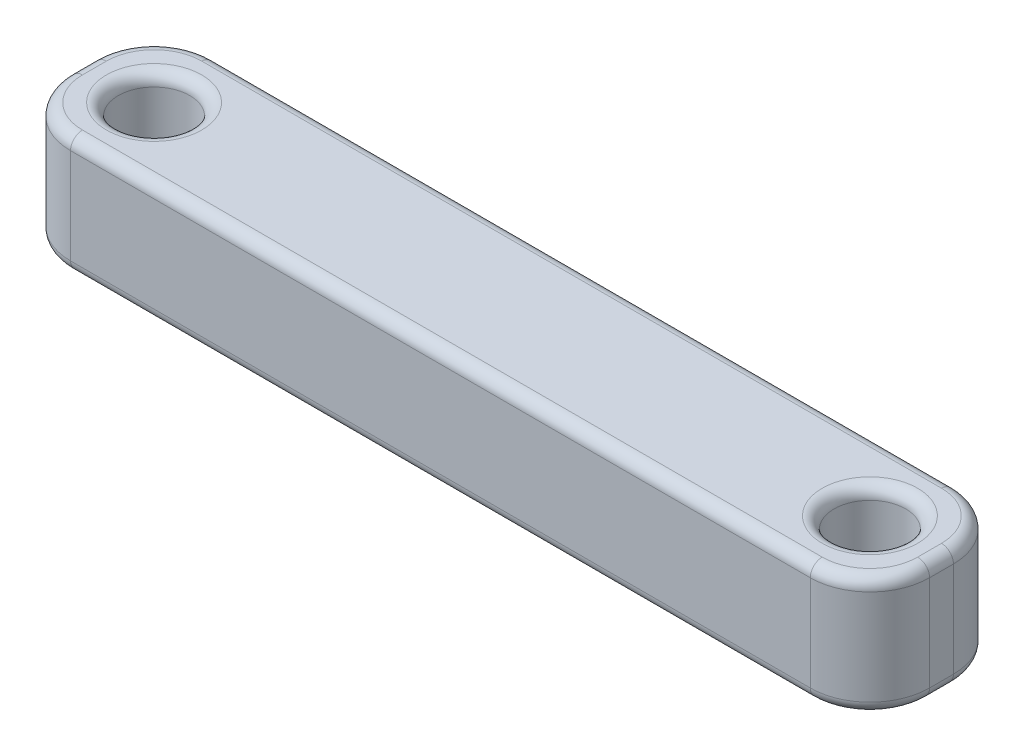
ISO-10303-21;
HEADER;
FILE_DESCRIPTION(('STEP AP214'),'2;1');
FILE_NAME('part.step','',(''),(''),'','','');
FILE_SCHEMA(('AUTOMOTIVE_DESIGN { 1 0 10303 214 1 1 1 1 }'));
ENDSEC;
DATA;
#1=APPLICATION_CONTEXT('core data for automotive mechanical design processes');
#2=APPLICATION_PROTOCOL_DEFINITION('international standard','automotive_design',2000,#1);
#3=PRODUCT_CONTEXT('',#1,'mechanical');
#4=PRODUCT('Part','Part','',(#3));
#5=PRODUCT_RELATED_PRODUCT_CATEGORY('part','',(#4));
#6=PRODUCT_DEFINITION_FORMATION('','',#4);
#7=PRODUCT_DEFINITION_CONTEXT('part definition',#1,'design');
#8=PRODUCT_DEFINITION('design','',#6,#7);
#9=PRODUCT_DEFINITION_SHAPE('','',#8);
#10=(LENGTH_UNIT() NAMED_UNIT(*) SI_UNIT(.MILLI.,.METRE.));
#11=(NAMED_UNIT(*) PLANE_ANGLE_UNIT() SI_UNIT($,.RADIAN.));
#12=(NAMED_UNIT(*) SI_UNIT($,.STERADIAN.) SOLID_ANGLE_UNIT());
#13=UNCERTAINTY_MEASURE_WITH_UNIT(LENGTH_MEASURE(1.E-05),#10,'distance_accuracy_value','');
#14=(GEOMETRIC_REPRESENTATION_CONTEXT(3) GLOBAL_UNCERTAINTY_ASSIGNED_CONTEXT((#13)) GLOBAL_UNIT_ASSIGNED_CONTEXT((#10,
#11,#12)) REPRESENTATION_CONTEXT('',''));
#15=CARTESIAN_POINT('',(0.,0.,0.));
#16=DIRECTION('',(0.,0.,1.));
#17=DIRECTION('',(1.,0.,0.));
#18=AXIS2_PLACEMENT_3D('',#15,#16,#17);
#19=CARTESIAN_POINT('',(18.,5.,3.));
#20=DIRECTION('',(-1.,0.,0.));
#21=DIRECTION('',(0.,0.,1.));
#22=AXIS2_PLACEMENT_3D('',#19,#20,#21);
#23=PLANE('',#22);
#24=DIRECTION('',(0.,-1.,0.));
#25=VECTOR('',#24,1.);
#26=CARTESIAN_POINT('',(18.,5.,0.5));
#27=LINE('',#26,#25);
#28=CARTESIAN_POINT('',(18.,4.5,0.5));
#29=VERTEX_POINT('',#28);
#30=CARTESIAN_POINT('',(18.,0.5,0.5));
#31=VERTEX_POINT('',#30);
#32=EDGE_CURVE('E307',#29,#31,#27,.T.);
#33=ORIENTED_EDGE('',*,*,#32,.T.);
#34=DIRECTION('',(0.,0.,-1.));
#35=VECTOR('',#34,1.);
#36=CARTESIAN_POINT('',(18.,0.5,-0.5));
#37=LINE('',#36,#35);
#38=CARTESIAN_POINT('',(18.,0.5,-0.5));
#39=VERTEX_POINT('',#38);
#40=EDGE_CURVE('E204',#31,#39,#37,.T.);
#41=ORIENTED_EDGE('',*,*,#40,.T.);
#42=DIRECTION('',(0.,-1.,0.));
#43=VECTOR('',#42,1.);
#44=CARTESIAN_POINT('',(18.,5.,-0.5));
#45=LINE('',#44,#43);
#46=CARTESIAN_POINT('',(18.,4.5,-0.5));
#47=VERTEX_POINT('',#46);
#48=EDGE_CURVE('E312',#39,#47,#45,.F.);
#49=ORIENTED_EDGE('',*,*,#48,.T.);
#50=DIRECTION('',(0.,0.,-1.));
#51=VECTOR('',#50,1.);
#52=CARTESIAN_POINT('',(18.,4.5,3.));
#53=LINE('',#52,#51);
#54=EDGE_CURVE('E202',#47,#29,#53,.F.);
#55=ORIENTED_EDGE('',*,*,#54,.T.);
#56=EDGE_LOOP('',(#33,#41,#49,#55));
#57=FACE_BOUND('',#56,.T.);
#58=ADVANCED_FACE('F37',(#57),#23,.F.);
#59=CARTESIAN_POINT('',(-18.,5.,-3.));
#60=DIRECTION('',(0.,0.,1.));
#61=DIRECTION('',(1.,0.,0.));
#62=AXIS2_PLACEMENT_3D('',#59,#60,#61);
#63=PLANE('',#62);
#64=DIRECTION('',(0.,-1.,0.));
#65=VECTOR('',#64,1.);
#66=CARTESIAN_POINT('',(15.5,5.,-3.));
#67=LINE('',#66,#65);
#68=CARTESIAN_POINT('',(15.5,4.5,-3.));
#69=VERTEX_POINT('',#68);
#70=CARTESIAN_POINT('',(15.5,0.5,-3.));
#71=VERTEX_POINT('',#70);
#72=EDGE_CURVE('E305',#69,#71,#67,.T.);
#73=ORIENTED_EDGE('',*,*,#72,.T.);
#74=DIRECTION('',(-1.,0.,0.));
#75=VECTOR('',#74,1.);
#76=CARTESIAN_POINT('',(-15.5,0.5,-3.));
#77=LINE('',#76,#75);
#78=CARTESIAN_POINT('',(-15.5,0.5,-3.));
#79=VERTEX_POINT('',#78);
#80=EDGE_CURVE('E212',#71,#79,#77,.T.);
#81=ORIENTED_EDGE('',*,*,#80,.T.);
#82=DIRECTION('',(0.,-1.,0.));
#83=VECTOR('',#82,1.);
#84=CARTESIAN_POINT('',(-15.5,5.,-3.));
#85=LINE('',#84,#83);
#86=CARTESIAN_POINT('',(-15.5,4.5,-3.));
#87=VERTEX_POINT('',#86);
#88=EDGE_CURVE('E261',#79,#87,#85,.F.);
#89=ORIENTED_EDGE('',*,*,#88,.T.);
#90=DIRECTION('',(-1.,0.,0.));
#91=VECTOR('',#90,1.);
#92=CARTESIAN_POINT('',(-18.,4.5,-3.));
#93=LINE('',#92,#91);
#94=EDGE_CURVE('E210',#87,#69,#93,.F.);
#95=ORIENTED_EDGE('',*,*,#94,.T.);
#96=EDGE_LOOP('',(#73,#81,#89,#95));
#97=FACE_BOUND('',#96,.T.);
#98=ADVANCED_FACE('F303',(#97),#63,.F.);
#99=CARTESIAN_POINT('',(-18.,5.,3.));
#100=DIRECTION('',(1.,0.,0.));
#101=DIRECTION('',(0.,0.,-1.));
#102=AXIS2_PLACEMENT_3D('',#99,#100,#101);
#103=PLANE('',#102);
#104=DIRECTION('',(0.,-1.,0.));
#105=VECTOR('',#104,1.);
#106=CARTESIAN_POINT('',(-18.,5.,-0.5));
#107=LINE('',#106,#105);
#108=CARTESIAN_POINT('',(-18.,4.5,-0.5));
#109=VERTEX_POINT('',#108);
#110=CARTESIAN_POINT('',(-18.,0.5,-0.5));
#111=VERTEX_POINT('',#110);
#112=EDGE_CURVE('E300',#109,#111,#107,.T.);
#113=ORIENTED_EDGE('',*,*,#112,.T.);
#114=DIRECTION('',(0.,0.,1.));
#115=VECTOR('',#114,1.);
#116=CARTESIAN_POINT('',(-18.,0.5,0.5));
#117=LINE('',#116,#115);
#118=CARTESIAN_POINT('',(-18.,0.5,0.5));
#119=VERTEX_POINT('',#118);
#120=EDGE_CURVE('E187',#111,#119,#117,.T.);
#121=ORIENTED_EDGE('',*,*,#120,.T.);
#122=DIRECTION('',(0.,-1.,0.));
#123=VECTOR('',#122,1.);
#124=CARTESIAN_POINT('',(-18.,5.,0.5));
#125=LINE('',#124,#123);
#126=CARTESIAN_POINT('',(-18.,4.5,0.5));
#127=VERTEX_POINT('',#126);
#128=EDGE_CURVE('E321',#119,#127,#125,.F.);
#129=ORIENTED_EDGE('',*,*,#128,.T.);
#130=DIRECTION('',(0.,0.,1.));
#131=VECTOR('',#130,1.);
#132=CARTESIAN_POINT('',(-18.,4.5,3.));
#133=LINE('',#132,#131);
#134=EDGE_CURVE('E185',#127,#109,#133,.F.);
#135=ORIENTED_EDGE('',*,*,#134,.T.);
#136=EDGE_LOOP('',(#113,#121,#129,#135));
#137=FACE_BOUND('',#136,.T.);
#138=ADVANCED_FACE('F348',(#137),#103,.F.);
#139=CARTESIAN_POINT('',(-18.,5.,3.));
#140=DIRECTION('',(0.,0.,-1.));
#141=DIRECTION('',(-1.,0.,0.));
#142=AXIS2_PLACEMENT_3D('',#139,#140,#141);
#143=PLANE('',#142);
#144=DIRECTION('',(0.,-1.,0.));
#145=VECTOR('',#144,1.);
#146=CARTESIAN_POINT('',(-15.5,5.,3.));
#147=LINE('',#146,#145);
#148=CARTESIAN_POINT('',(-15.5,4.5,3.));
#149=VERTEX_POINT('',#148);
#150=CARTESIAN_POINT('',(-15.5,0.5,3.));
#151=VERTEX_POINT('',#150);
#152=EDGE_CURVE('E315',#149,#151,#147,.T.);
#153=ORIENTED_EDGE('',*,*,#152,.T.);
#154=DIRECTION('',(1.,0.,0.));
#155=VECTOR('',#154,1.);
#156=CARTESIAN_POINT('',(15.5,0.5,3.));
#157=LINE('',#156,#155);
#158=CARTESIAN_POINT('',(15.5,0.5,3.));
#159=VERTEX_POINT('',#158);
#160=EDGE_CURVE('E195',#151,#159,#157,.T.);
#161=ORIENTED_EDGE('',*,*,#160,.T.);
#162=DIRECTION('',(0.,-1.,0.));
#163=VECTOR('',#162,1.);
#164=CARTESIAN_POINT('',(15.5,5.,3.));
#165=LINE('',#164,#163);
#166=CARTESIAN_POINT('',(15.5,4.5,3.));
#167=VERTEX_POINT('',#166);
#168=EDGE_CURVE('E318',#159,#167,#165,.F.);
#169=ORIENTED_EDGE('',*,*,#168,.T.);
#170=DIRECTION('',(1.,0.,0.));
#171=VECTOR('',#170,1.);
#172=CARTESIAN_POINT('',(-18.,4.5,3.));
#173=LINE('',#172,#171);
#174=EDGE_CURVE('E193',#167,#149,#173,.F.);
#175=ORIENTED_EDGE('',*,*,#174,.T.);
#176=EDGE_LOOP('',(#153,#161,#169,#175));
#177=FACE_BOUND('',#176,.T.);
#178=ADVANCED_FACE('F392',(#177),#143,.F.);
#179=CARTESIAN_POINT('',(0.,5.,0.));
#180=DIRECTION('',(0.,-1.,0.));
#181=DIRECTION('',(0.,0.,-1.));
#182=AXIS2_PLACEMENT_3D('',#179,#180,#181);
#183=PLANE('',#182);
#184=DIRECTION('',(1.,0.,0.));
#185=VECTOR('',#184,1.);
#186=CARTESIAN_POINT('',(0.,5.,2.5));
#187=LINE('',#186,#185);
#188=CARTESIAN_POINT('',(-15.5,5.,2.5));
#189=VERTEX_POINT('',#188);
#190=CARTESIAN_POINT('',(15.5,5.,2.5));
#191=VERTEX_POINT('',#190);
#192=EDGE_CURVE('E46',#189,#191,#187,.T.);
#193=ORIENTED_EDGE('',*,*,#192,.T.);
#194=CARTESIAN_POINT('',(15.5,5.,0.5));
#195=DIRECTION('',(0.,-1.,0.));
#196=DIRECTION('',(0.,0.,-1.));
#197=AXIS2_PLACEMENT_3D('',#194,#195,#196);
#198=CIRCLE('',#197,2.);
#199=CARTESIAN_POINT('',(17.5,5.,0.5));
#200=VERTEX_POINT('',#199);
#201=EDGE_CURVE('E11',#191,#200,#198,.F.);
#202=ORIENTED_EDGE('',*,*,#201,.T.);
#203=DIRECTION('',(0.,0.,-1.));
#204=VECTOR('',#203,1.);
#205=CARTESIAN_POINT('',(17.5,5.,0.));
#206=LINE('',#205,#204);
#207=CARTESIAN_POINT('',(17.5,5.,-0.5));
#208=VERTEX_POINT('',#207);
#209=EDGE_CURVE('E232',#200,#208,#206,.T.);
#210=ORIENTED_EDGE('',*,*,#209,.T.);
#211=CARTESIAN_POINT('',(15.5,5.,-0.5));
#212=DIRECTION('',(0.,-1.,0.));
#213=DIRECTION('',(0.,0.,-1.));
#214=AXIS2_PLACEMENT_3D('',#211,#212,#213);
#215=CIRCLE('',#214,2.);
#216=CARTESIAN_POINT('',(15.5,5.,-2.5));
#217=VERTEX_POINT('',#216);
#218=EDGE_CURVE('E234',#208,#217,#215,.F.);
#219=ORIENTED_EDGE('',*,*,#218,.T.);
#220=DIRECTION('',(-1.,0.,0.));
#221=VECTOR('',#220,1.);
#222=CARTESIAN_POINT('',(0.,5.,-2.5));
#223=LINE('',#222,#221);
#224=CARTESIAN_POINT('',(-15.5,5.,-2.5));
#225=VERTEX_POINT('',#224);
#226=EDGE_CURVE('E236',#217,#225,#223,.T.);
#227=ORIENTED_EDGE('',*,*,#226,.T.);
#228=CARTESIAN_POINT('',(-15.5,5.,-0.5));
#229=DIRECTION('',(0.,-1.,0.));
#230=DIRECTION('',(0.,0.,-1.));
#231=AXIS2_PLACEMENT_3D('',#228,#229,#230);
#232=CIRCLE('',#231,2.);
#233=CARTESIAN_POINT('',(-17.5,5.,-0.5));
#234=VERTEX_POINT('',#233);
#235=EDGE_CURVE('E238',#225,#234,#232,.F.);
#236=ORIENTED_EDGE('',*,*,#235,.T.);
#237=DIRECTION('',(0.,0.,1.));
#238=VECTOR('',#237,1.);
#239=CARTESIAN_POINT('',(-17.5,5.,0.));
#240=LINE('',#239,#238);
#241=CARTESIAN_POINT('',(-17.5,5.,0.5));
#242=VERTEX_POINT('',#241);
#243=EDGE_CURVE('E240',#234,#242,#240,.T.);
#244=ORIENTED_EDGE('',*,*,#243,.T.);
#245=CARTESIAN_POINT('',(-15.5,5.,0.5));
#246=DIRECTION('',(0.,-1.,0.));
#247=DIRECTION('',(0.,0.,-1.));
#248=AXIS2_PLACEMENT_3D('',#245,#246,#247);
#249=CIRCLE('',#248,2.);
#250=EDGE_CURVE('E57',#242,#189,#249,.F.);
#251=ORIENTED_EDGE('',*,*,#250,.T.);
#252=EDGE_LOOP('',(#193,#202,#210,#219,#227,#236,#244,#251));
#253=FACE_BOUND('',#252,.T.);
#254=CARTESIAN_POINT('',(15.,5.,0.));
#255=DIRECTION('',(0.,-1.,0.));
#256=DIRECTION('',(0.,0.,-1.));
#257=AXIS2_PLACEMENT_3D('',#254,#255,#256);
#258=CIRCLE('',#257,2.);
#259=CARTESIAN_POINT('',(15.,5.,-2.));
#260=VERTEX_POINT('',#259);
#261=EDGE_CURVE('E229',#260,#260,#258,.T.);
#262=ORIENTED_EDGE('',*,*,#261,.T.);
#263=EDGE_LOOP('',(#262));
#264=FACE_BOUND('',#263,.T.);
#265=CARTESIAN_POINT('',(-15.,5.,0.));
#266=DIRECTION('',(0.,-1.,0.));
#267=DIRECTION('',(0.,0.,-1.));
#268=AXIS2_PLACEMENT_3D('',#265,#266,#267);
#269=CIRCLE('',#268,2.);
#270=CARTESIAN_POINT('',(-15.,5.,-2.));
#271=VERTEX_POINT('',#270);
#272=EDGE_CURVE('E226',#271,#271,#269,.T.);
#273=ORIENTED_EDGE('',*,*,#272,.T.);
#274=EDGE_LOOP('',(#273));
#275=FACE_BOUND('',#274,.T.);
#276=ADVANCED_FACE('F364',(#253,#264,#275),#183,.F.);
#277=CARTESIAN_POINT('',(0.,0.,0.));
#278=DIRECTION('',(0.,-1.,0.));
#279=DIRECTION('',(0.,0.,-1.));
#280=AXIS2_PLACEMENT_3D('',#277,#278,#279);
#281=PLANE('',#280);
#282=DIRECTION('',(0.,0.,1.));
#283=VECTOR('',#282,1.);
#284=CARTESIAN_POINT('',(-17.5,0.,-0.5));
#285=LINE('',#284,#283);
#286=CARTESIAN_POINT('',(-17.5,0.,0.5));
#287=VERTEX_POINT('',#286);
#288=CARTESIAN_POINT('',(-17.5,0.,-0.5));
#289=VERTEX_POINT('',#288);
#290=EDGE_CURVE('E175',#287,#289,#285,.F.);
#291=ORIENTED_EDGE('',*,*,#290,.T.);
#292=CARTESIAN_POINT('',(-15.5,0.,-0.5));
#293=DIRECTION('',(0.,-1.,0.));
#294=DIRECTION('',(0.,0.,-1.));
#295=AXIS2_PLACEMENT_3D('',#292,#293,#294);
#296=CIRCLE('',#295,2.);
#297=CARTESIAN_POINT('',(-15.5,0.,-2.5));
#298=VERTEX_POINT('',#297);
#299=EDGE_CURVE('E155',#289,#298,#296,.T.);
#300=ORIENTED_EDGE('',*,*,#299,.T.);
#301=DIRECTION('',(-1.,0.,0.));
#302=VECTOR('',#301,1.);
#303=CARTESIAN_POINT('',(15.5,0.,-2.5));
#304=LINE('',#303,#302);
#305=CARTESIAN_POINT('',(15.5,0.,-2.5));
#306=VERTEX_POINT('',#305);
#307=EDGE_CURVE('E163',#298,#306,#304,.F.);
#308=ORIENTED_EDGE('',*,*,#307,.T.);
#309=CARTESIAN_POINT('',(15.5,0.,-0.5));
#310=DIRECTION('',(0.,-1.,0.));
#311=DIRECTION('',(0.,0.,-1.));
#312=AXIS2_PLACEMENT_3D('',#309,#310,#311);
#313=CIRCLE('',#312,2.);
#314=CARTESIAN_POINT('',(17.5,0.,-0.5));
#315=VERTEX_POINT('',#314);
#316=EDGE_CURVE('E169',#306,#315,#313,.T.);
#317=ORIENTED_EDGE('',*,*,#316,.T.);
#318=DIRECTION('',(0.,0.,-1.));
#319=VECTOR('',#318,1.);
#320=CARTESIAN_POINT('',(17.5,0.,0.5));
#321=LINE('',#320,#319);
#322=CARTESIAN_POINT('',(17.5,0.,0.5));
#323=VERTEX_POINT('',#322);
#324=EDGE_CURVE('E331',#315,#323,#321,.F.);
#325=ORIENTED_EDGE('',*,*,#324,.T.);
#326=CARTESIAN_POINT('',(15.5,0.,0.5));
#327=DIRECTION('',(0.,-1.,0.));
#328=DIRECTION('',(0.,0.,-1.));
#329=AXIS2_PLACEMENT_3D('',#326,#327,#328);
#330=CIRCLE('',#329,2.);
#331=CARTESIAN_POINT('',(15.5,0.,2.5));
#332=VERTEX_POINT('',#331);
#333=EDGE_CURVE('E333',#323,#332,#330,.T.);
#334=ORIENTED_EDGE('',*,*,#333,.T.);
#335=DIRECTION('',(1.,0.,0.));
#336=VECTOR('',#335,1.);
#337=CARTESIAN_POINT('',(-15.5,0.,2.5));
#338=LINE('',#337,#336);
#339=CARTESIAN_POINT('',(-15.5,0.,2.5));
#340=VERTEX_POINT('',#339);
#341=EDGE_CURVE('E335',#332,#340,#338,.F.);
#342=ORIENTED_EDGE('',*,*,#341,.T.);
#343=CARTESIAN_POINT('',(-15.5,0.,0.5));
#344=DIRECTION('',(0.,-1.,0.));
#345=DIRECTION('',(0.,0.,-1.));
#346=AXIS2_PLACEMENT_3D('',#343,#344,#345);
#347=CIRCLE('',#346,2.);
#348=EDGE_CURVE('E180',#340,#287,#347,.T.);
#349=ORIENTED_EDGE('',*,*,#348,.T.);
#350=EDGE_LOOP('',(#291,#300,#308,#317,#325,#334,#342,#349));
#351=FACE_BOUND('',#350,.T.);
#352=CARTESIAN_POINT('',(15.,0.,0.));
#353=DIRECTION('',(0.,-1.,0.));
#354=DIRECTION('',(0.,0.,-1.));
#355=AXIS2_PLACEMENT_3D('',#352,#353,#354);
#356=CIRCLE('',#355,2.);
#357=CARTESIAN_POINT('',(15.,0.,-2.));
#358=VERTEX_POINT('',#357);
#359=EDGE_CURVE('E170',#358,#358,#356,.F.);
#360=ORIENTED_EDGE('',*,*,#359,.T.);
#361=EDGE_LOOP('',(#360));
#362=FACE_BOUND('',#361,.T.);
#363=CARTESIAN_POINT('',(-15.,0.,0.));
#364=DIRECTION('',(0.,-1.,0.));
#365=DIRECTION('',(0.,0.,-1.));
#366=AXIS2_PLACEMENT_3D('',#363,#364,#365);
#367=CIRCLE('',#366,2.);
#368=CARTESIAN_POINT('',(-15.,0.,-2.));
#369=VERTEX_POINT('',#368);
#370=EDGE_CURVE('E325',#369,#369,#367,.F.);
#371=ORIENTED_EDGE('',*,*,#370,.T.);
#372=EDGE_LOOP('',(#371));
#373=FACE_BOUND('',#372,.T.);
#374=ADVANCED_FACE('F172',(#351,#362,#373),#281,.T.);
#375=CARTESIAN_POINT('',(15.,0.,0.));
#376=DIRECTION('',(0.,1.,0.));
#377=DIRECTION('',(0.,0.,1.));
#378=AXIS2_PLACEMENT_3D('',#375,#376,#377);
#379=CYLINDRICAL_SURFACE('',#378,1.5);
#380=CARTESIAN_POINT('',(15.,0.5,0.));
#381=DIRECTION('',(0.,-1.,0.));
#382=DIRECTION('',(0.,0.,-1.));
#383=AXIS2_PLACEMENT_3D('',#380,#381,#382);
#384=CIRCLE('',#383,1.5);
#385=CARTESIAN_POINT('',(15.,0.5,-1.5));
#386=VERTEX_POINT('',#385);
#387=EDGE_CURVE('E217',#386,#386,#384,.T.);
#388=ORIENTED_EDGE('',*,*,#387,.T.);
#389=EDGE_LOOP('',(#388));
#390=FACE_BOUND('',#389,.T.);
#391=CARTESIAN_POINT('',(15.,4.5,0.));
#392=DIRECTION('',(0.,-1.,0.));
#393=DIRECTION('',(0.,0.,-1.));
#394=AXIS2_PLACEMENT_3D('',#391,#392,#393);
#395=CIRCLE('',#394,1.5);
#396=CARTESIAN_POINT('',(15.,4.5,-1.5));
#397=VERTEX_POINT('',#396);
#398=EDGE_CURVE('E214',#397,#397,#395,.F.);
#399=ORIENTED_EDGE('',*,*,#398,.T.);
#400=EDGE_LOOP('',(#399));
#401=FACE_BOUND('',#400,.T.);
#402=ADVANCED_FACE('F475',(#390,#401),#379,.F.);
#403=CARTESIAN_POINT('',(-15.,0.,0.));
#404=DIRECTION('',(0.,1.,0.));
#405=DIRECTION('',(0.,0.,1.));
#406=AXIS2_PLACEMENT_3D('',#403,#404,#405);
#407=CYLINDRICAL_SURFACE('',#406,1.5);
#408=CARTESIAN_POINT('',(-15.,0.5,0.));
#409=DIRECTION('',(0.,-1.,0.));
#410=DIRECTION('',(0.,0.,-1.));
#411=AXIS2_PLACEMENT_3D('',#408,#409,#410);
#412=CIRCLE('',#411,1.5);
#413=CARTESIAN_POINT('',(-15.,0.5,-1.5));
#414=VERTEX_POINT('',#413);
#415=EDGE_CURVE('E223',#414,#414,#412,.T.);
#416=ORIENTED_EDGE('',*,*,#415,.T.);
#417=EDGE_LOOP('',(#416));
#418=FACE_BOUND('',#417,.T.);
#419=CARTESIAN_POINT('',(-15.,4.5,0.));
#420=DIRECTION('',(0.,-1.,0.));
#421=DIRECTION('',(0.,0.,-1.));
#422=AXIS2_PLACEMENT_3D('',#419,#420,#421);
#423=CIRCLE('',#422,1.5);
#424=CARTESIAN_POINT('',(-15.,4.5,-1.5));
#425=VERTEX_POINT('',#424);
#426=EDGE_CURVE('E220',#425,#425,#423,.F.);
#427=ORIENTED_EDGE('',*,*,#426,.T.);
#428=EDGE_LOOP('',(#427));
#429=FACE_BOUND('',#428,.T.);
#430=ADVANCED_FACE('F412',(#418,#429),#407,.F.);
#431=CARTESIAN_POINT('',(15.5,5.,-0.5));
#432=DIRECTION('',(0.,-1.,0.));
#433=DIRECTION('',(0.,0.,-1.));
#434=AXIS2_PLACEMENT_3D('',#431,#432,#433);
#435=CYLINDRICAL_SURFACE('',#434,2.5);
#436=ORIENTED_EDGE('',*,*,#48,.F.);
#437=CARTESIAN_POINT('',(15.5,0.5,-0.5));
#438=DIRECTION('',(0.,-1.,0.));
#439=DIRECTION('',(0.,0.,-1.));
#440=AXIS2_PLACEMENT_3D('',#437,#438,#439);
#441=CIRCLE('',#440,2.5);
#442=EDGE_CURVE('E208',#39,#71,#441,.F.);
#443=ORIENTED_EDGE('',*,*,#442,.T.);
#444=ORIENTED_EDGE('',*,*,#72,.F.);
#445=CARTESIAN_POINT('',(15.5,4.5,-0.5));
#446=DIRECTION('',(0.,-1.,0.));
#447=DIRECTION('',(0.,0.,-1.));
#448=AXIS2_PLACEMENT_3D('',#445,#446,#447);
#449=CIRCLE('',#448,2.5);
#450=EDGE_CURVE('E206',#69,#47,#449,.T.);
#451=ORIENTED_EDGE('',*,*,#450,.T.);
#452=EDGE_LOOP('',(#436,#443,#444,#451));
#453=FACE_BOUND('',#452,.T.);
#454=ADVANCED_FACE('F409',(#453),#435,.T.);
#455=CARTESIAN_POINT('',(15.5,5.,0.5));
#456=DIRECTION('',(0.,-1.,0.));
#457=DIRECTION('',(0.,0.,-1.));
#458=AXIS2_PLACEMENT_3D('',#455,#456,#457);
#459=CYLINDRICAL_SURFACE('',#458,2.5);
#460=ORIENTED_EDGE('',*,*,#168,.F.);
#461=CARTESIAN_POINT('',(15.5,0.5,0.5));
#462=DIRECTION('',(0.,-1.,0.));
#463=DIRECTION('',(0.,0.,-1.));
#464=AXIS2_PLACEMENT_3D('',#461,#462,#463);
#465=CIRCLE('',#464,2.5);
#466=EDGE_CURVE('E200',#159,#31,#465,.F.);
#467=ORIENTED_EDGE('',*,*,#466,.T.);
#468=ORIENTED_EDGE('',*,*,#32,.F.);
#469=CARTESIAN_POINT('',(15.5,4.5,0.5));
#470=DIRECTION('',(0.,-1.,0.));
#471=DIRECTION('',(0.,0.,-1.));
#472=AXIS2_PLACEMENT_3D('',#469,#470,#471);
#473=CIRCLE('',#472,2.5);
#474=EDGE_CURVE('E197',#29,#167,#473,.T.);
#475=ORIENTED_EDGE('',*,*,#474,.T.);
#476=EDGE_LOOP('',(#460,#467,#468,#475));
#477=FACE_BOUND('',#476,.T.);
#478=ADVANCED_FACE('F381',(#477),#459,.T.);
#479=CARTESIAN_POINT('',(-15.5,5.,-0.5));
#480=DIRECTION('',(0.,-1.,0.));
#481=DIRECTION('',(0.,0.,-1.));
#482=AXIS2_PLACEMENT_3D('',#479,#480,#481);
#483=CYLINDRICAL_SURFACE('',#482,2.5);
#484=ORIENTED_EDGE('',*,*,#88,.F.);
#485=CARTESIAN_POINT('',(-15.5,0.5,-0.5));
#486=DIRECTION('',(0.,-1.,0.));
#487=DIRECTION('',(0.,0.,-1.));
#488=AXIS2_PLACEMENT_3D('',#485,#486,#487);
#489=CIRCLE('',#488,2.5);
#490=EDGE_CURVE('E157',#79,#111,#489,.F.);
#491=ORIENTED_EDGE('',*,*,#490,.T.);
#492=ORIENTED_EDGE('',*,*,#112,.F.);
#493=CARTESIAN_POINT('',(-15.5,4.5,-0.5));
#494=DIRECTION('',(0.,-1.,0.));
#495=DIRECTION('',(0.,0.,-1.));
#496=AXIS2_PLACEMENT_3D('',#493,#494,#495);
#497=CIRCLE('',#496,2.5);
#498=EDGE_CURVE('E177',#109,#87,#497,.T.);
#499=ORIENTED_EDGE('',*,*,#498,.T.);
#500=EDGE_LOOP('',(#484,#491,#492,#499));
#501=FACE_BOUND('',#500,.T.);
#502=ADVANCED_FACE('F298',(#501),#483,.T.);
#503=CARTESIAN_POINT('',(-15.5,5.,0.5));
#504=DIRECTION('',(0.,-1.,0.));
#505=DIRECTION('',(0.,0.,-1.));
#506=AXIS2_PLACEMENT_3D('',#503,#504,#505);
#507=CYLINDRICAL_SURFACE('',#506,2.5);
#508=ORIENTED_EDGE('',*,*,#128,.F.);
#509=CARTESIAN_POINT('',(-15.5,0.5,0.5));
#510=DIRECTION('',(0.,-1.,0.));
#511=DIRECTION('',(0.,0.,-1.));
#512=AXIS2_PLACEMENT_3D('',#509,#510,#511);
#513=CIRCLE('',#512,2.5);
#514=EDGE_CURVE('E191',#119,#151,#513,.F.);
#515=ORIENTED_EDGE('',*,*,#514,.T.);
#516=ORIENTED_EDGE('',*,*,#152,.F.);
#517=CARTESIAN_POINT('',(-15.5,4.5,0.5));
#518=DIRECTION('',(0.,-1.,0.));
#519=DIRECTION('',(0.,0.,-1.));
#520=AXIS2_PLACEMENT_3D('',#517,#518,#519);
#521=CIRCLE('',#520,2.5);
#522=EDGE_CURVE('E189',#149,#127,#521,.T.);
#523=ORIENTED_EDGE('',*,*,#522,.T.);
#524=EDGE_LOOP('',(#508,#515,#516,#523));
#525=FACE_BOUND('',#524,.T.);
#526=ADVANCED_FACE('F350',(#525),#507,.T.);
#527=CARTESIAN_POINT('',(15.5,0.5,0.5));
#528=DIRECTION('',(0.,-1.,0.));
#529=DIRECTION('',(0.,0.,-1.));
#530=AXIS2_PLACEMENT_3D('',#527,#528,#529);
#531=TOROIDAL_SURFACE('',#530,2.,0.5);
#532=CARTESIAN_POINT('',(17.5,0.5,0.5));
#533=DIRECTION('',(0.,0.,-1.));
#534=DIRECTION('',(-1.,0.,0.));
#535=AXIS2_PLACEMENT_3D('',#532,#533,#534);
#536=CIRCLE('',#535,0.5);
#537=EDGE_CURVE('E255',#31,#323,#536,.T.);
#538=ORIENTED_EDGE('',*,*,#537,.F.);
#539=ORIENTED_EDGE('',*,*,#466,.F.);
#540=CARTESIAN_POINT('',(15.5,0.5,2.5));
#541=DIRECTION('',(-1.,0.,0.));
#542=DIRECTION('',(0.,0.,1.));
#543=AXIS2_PLACEMENT_3D('',#540,#541,#542);
#544=CIRCLE('',#543,0.5);
#545=EDGE_CURVE('E258',#332,#159,#544,.T.);
#546=ORIENTED_EDGE('',*,*,#545,.F.);
#547=ORIENTED_EDGE('',*,*,#333,.F.);
#548=EDGE_LOOP('',(#538,#539,#546,#547));
#549=FACE_BOUND('',#548,.T.);
#550=ADVANCED_FACE('F385',(#549),#531,.T.);
#551=CARTESIAN_POINT('',(-18.,0.5,2.5));
#552=DIRECTION('',(-1.,0.,0.));
#553=DIRECTION('',(0.,0.,1.));
#554=AXIS2_PLACEMENT_3D('',#551,#552,#553);
#555=CYLINDRICAL_SURFACE('',#554,0.5);
#556=ORIENTED_EDGE('',*,*,#545,.T.);
#557=ORIENTED_EDGE('',*,*,#160,.F.);
#558=CARTESIAN_POINT('',(-15.5,0.5,2.5));
#559=DIRECTION('',(-1.,0.,0.));
#560=DIRECTION('',(0.,0.,1.));
#561=AXIS2_PLACEMENT_3D('',#558,#559,#560);
#562=CIRCLE('',#561,0.5);
#563=EDGE_CURVE('E252',#340,#151,#562,.T.);
#564=ORIENTED_EDGE('',*,*,#563,.F.);
#565=ORIENTED_EDGE('',*,*,#341,.F.);
#566=EDGE_LOOP('',(#556,#557,#564,#565));
#567=FACE_BOUND('',#566,.T.);
#568=ADVANCED_FACE('F390',(#567),#555,.T.);
#569=CARTESIAN_POINT('',(17.5,0.5,3.));
#570=DIRECTION('',(0.,0.,1.));
#571=DIRECTION('',(1.,0.,0.));
#572=AXIS2_PLACEMENT_3D('',#569,#570,#571);
#573=CYLINDRICAL_SURFACE('',#572,0.5);
#574=ORIENTED_EDGE('',*,*,#537,.T.);
#575=ORIENTED_EDGE('',*,*,#324,.F.);
#576=CARTESIAN_POINT('',(17.5,0.5,-0.5));
#577=DIRECTION('',(0.,0.,-1.));
#578=DIRECTION('',(-1.,0.,0.));
#579=AXIS2_PLACEMENT_3D('',#576,#577,#578);
#580=CIRCLE('',#579,0.5);
#581=EDGE_CURVE('E249',#39,#315,#580,.T.);
#582=ORIENTED_EDGE('',*,*,#581,.F.);
#583=ORIENTED_EDGE('',*,*,#40,.F.);
#584=EDGE_LOOP('',(#574,#575,#582,#583));
#585=FACE_BOUND('',#584,.T.);
#586=ADVANCED_FACE('F433',(#585),#573,.T.);
#587=CARTESIAN_POINT('',(-15.5,0.5,0.5));
#588=DIRECTION('',(0.,-1.,0.));
#589=DIRECTION('',(0.,0.,-1.));
#590=AXIS2_PLACEMENT_3D('',#587,#588,#589);
#591=TOROIDAL_SURFACE('',#590,2.,0.5);
#592=ORIENTED_EDGE('',*,*,#563,.T.);
#593=ORIENTED_EDGE('',*,*,#514,.F.);
#594=CARTESIAN_POINT('',(-17.5,0.5,0.5));
#595=DIRECTION('',(0.,0.,-1.));
#596=DIRECTION('',(-1.,0.,0.));
#597=AXIS2_PLACEMENT_3D('',#594,#595,#596);
#598=CIRCLE('',#597,0.5);
#599=EDGE_CURVE('E246',#287,#119,#598,.T.);
#600=ORIENTED_EDGE('',*,*,#599,.F.);
#601=ORIENTED_EDGE('',*,*,#348,.F.);
#602=EDGE_LOOP('',(#592,#593,#600,#601));
#603=FACE_BOUND('',#602,.T.);
#604=ADVANCED_FACE('F342',(#603),#591,.T.);
#605=CARTESIAN_POINT('',(15.5,0.5,-0.5));
#606=DIRECTION('',(0.,-1.,0.));
#607=DIRECTION('',(0.,0.,-1.));
#608=AXIS2_PLACEMENT_3D('',#605,#606,#607);
#609=TOROIDAL_SURFACE('',#608,2.,0.5);
#610=ORIENTED_EDGE('',*,*,#581,.T.);
#611=ORIENTED_EDGE('',*,*,#316,.F.);
#612=CARTESIAN_POINT('',(15.5,0.5,-2.5));
#613=DIRECTION('',(-1.,0.,0.));
#614=DIRECTION('',(0.,0.,1.));
#615=AXIS2_PLACEMENT_3D('',#612,#613,#614);
#616=CIRCLE('',#615,0.5);
#617=EDGE_CURVE('E166',#71,#306,#616,.T.);
#618=ORIENTED_EDGE('',*,*,#617,.F.);
#619=ORIENTED_EDGE('',*,*,#442,.F.);
#620=EDGE_LOOP('',(#610,#611,#618,#619));
#621=FACE_BOUND('',#620,.T.);
#622=ADVANCED_FACE('F427',(#621),#609,.T.);
#623=CARTESIAN_POINT('',(-17.5,0.5,3.));
#624=DIRECTION('',(0.,0.,-1.));
#625=DIRECTION('',(-1.,0.,0.));
#626=AXIS2_PLACEMENT_3D('',#623,#624,#625);
#627=CYLINDRICAL_SURFACE('',#626,0.5);
#628=ORIENTED_EDGE('',*,*,#599,.T.);
#629=ORIENTED_EDGE('',*,*,#120,.F.);
#630=CARTESIAN_POINT('',(-17.5,0.5,-0.5));
#631=DIRECTION('',(0.,0.,-1.));
#632=DIRECTION('',(-1.,0.,0.));
#633=AXIS2_PLACEMENT_3D('',#630,#631,#632);
#634=CIRCLE('',#633,0.5);
#635=EDGE_CURVE('E160',#289,#111,#634,.T.);
#636=ORIENTED_EDGE('',*,*,#635,.F.);
#637=ORIENTED_EDGE('',*,*,#290,.F.);
#638=EDGE_LOOP('',(#628,#629,#636,#637));
#639=FACE_BOUND('',#638,.T.);
#640=ADVANCED_FACE('F345',(#639),#627,.T.);
#641=CARTESIAN_POINT('',(-18.,0.5,-2.5));
#642=DIRECTION('',(1.,0.,0.));
#643=DIRECTION('',(0.,0.,-1.));
#644=AXIS2_PLACEMENT_3D('',#641,#642,#643);
#645=CYLINDRICAL_SURFACE('',#644,0.5);
#646=ORIENTED_EDGE('',*,*,#617,.T.);
#647=ORIENTED_EDGE('',*,*,#307,.F.);
#648=CARTESIAN_POINT('',(-15.5,0.5,-2.5));
#649=DIRECTION('',(-1.,0.,0.));
#650=DIRECTION('',(0.,0.,1.));
#651=AXIS2_PLACEMENT_3D('',#648,#649,#650);
#652=CIRCLE('',#651,0.5);
#653=EDGE_CURVE('E151',#79,#298,#652,.T.);
#654=ORIENTED_EDGE('',*,*,#653,.F.);
#655=ORIENTED_EDGE('',*,*,#80,.F.);
#656=EDGE_LOOP('',(#646,#647,#654,#655));
#657=FACE_BOUND('',#656,.T.);
#658=ADVANCED_FACE('F164',(#657),#645,.T.);
#659=CARTESIAN_POINT('',(-15.5,0.5,-0.5));
#660=DIRECTION('',(0.,-1.,0.));
#661=DIRECTION('',(0.,0.,-1.));
#662=AXIS2_PLACEMENT_3D('',#659,#660,#661);
#663=TOROIDAL_SURFACE('',#662,2.,0.5);
#664=ORIENTED_EDGE('',*,*,#635,.T.);
#665=ORIENTED_EDGE('',*,*,#490,.F.);
#666=ORIENTED_EDGE('',*,*,#653,.T.);
#667=ORIENTED_EDGE('',*,*,#299,.F.);
#668=EDGE_LOOP('',(#664,#665,#666,#667));
#669=FACE_BOUND('',#668,.T.);
#670=ADVANCED_FACE('F153',(#669),#663,.T.);
#671=CARTESIAN_POINT('',(15.,0.5,0.));
#672=DIRECTION('',(0.,-1.,0.));
#673=DIRECTION('',(0.,0.,-1.));
#674=AXIS2_PLACEMENT_3D('',#671,#672,#673);
#675=TOROIDAL_SURFACE('',#674,2.,0.5);
#676=ORIENTED_EDGE('',*,*,#387,.F.);
#677=EDGE_LOOP('',(#676));
#678=FACE_BOUND('',#677,.T.);
#679=ORIENTED_EDGE('',*,*,#359,.F.);
#680=EDGE_LOOP('',(#679));
#681=FACE_BOUND('',#680,.T.);
#682=ADVANCED_FACE('F422',(#678,#681),#675,.T.);
#683=CARTESIAN_POINT('',(-15.,0.5,0.));
#684=DIRECTION('',(0.,-1.,0.));
#685=DIRECTION('',(0.,0.,-1.));
#686=AXIS2_PLACEMENT_3D('',#683,#684,#685);
#687=TOROIDAL_SURFACE('',#686,2.,0.5);
#688=ORIENTED_EDGE('',*,*,#415,.F.);
#689=EDGE_LOOP('',(#688));
#690=FACE_BOUND('',#689,.T.);
#691=ORIENTED_EDGE('',*,*,#370,.F.);
#692=EDGE_LOOP('',(#691));
#693=FACE_BOUND('',#692,.T.);
#694=ADVANCED_FACE('F443',(#690,#693),#687,.T.);
#695=CARTESIAN_POINT('',(-15.5,4.5,-0.5));
#696=DIRECTION('',(0.,-1.,0.));
#697=DIRECTION('',(0.,0.,-1.));
#698=AXIS2_PLACEMENT_3D('',#695,#696,#697);
#699=TOROIDAL_SURFACE('',#698,2.,0.5);
#700=CARTESIAN_POINT('',(-15.5,4.5,-2.5));
#701=DIRECTION('',(1.,0.,0.));
#702=DIRECTION('',(0.,0.,-1.));
#703=AXIS2_PLACEMENT_3D('',#700,#701,#702);
#704=CIRCLE('',#703,0.5);
#705=EDGE_CURVE('E277',#87,#225,#704,.T.);
#706=ORIENTED_EDGE('',*,*,#705,.F.);
#707=ORIENTED_EDGE('',*,*,#498,.F.);
#708=CARTESIAN_POINT('',(-17.5,4.5,-0.5));
#709=DIRECTION('',(0.,0.,1.));
#710=DIRECTION('',(1.,0.,0.));
#711=AXIS2_PLACEMENT_3D('',#708,#709,#710);
#712=CIRCLE('',#711,0.5);
#713=EDGE_CURVE('E41',#234,#109,#712,.T.);
#714=ORIENTED_EDGE('',*,*,#713,.F.);
#715=ORIENTED_EDGE('',*,*,#235,.F.);
#716=EDGE_LOOP('',(#706,#707,#714,#715));
#717=FACE_BOUND('',#716,.T.);
#718=ADVANCED_FACE('F293',(#717),#699,.T.);
#719=CARTESIAN_POINT('',(-17.5,4.5,0.));
#720=DIRECTION('',(0.,0.,1.));
#721=DIRECTION('',(1.,0.,0.));
#722=AXIS2_PLACEMENT_3D('',#719,#720,#721);
#723=CYLINDRICAL_SURFACE('',#722,0.5);
#724=ORIENTED_EDGE('',*,*,#713,.T.);
#725=ORIENTED_EDGE('',*,*,#134,.F.);
#726=CARTESIAN_POINT('',(-17.5,4.5,0.5));
#727=DIRECTION('',(0.,0.,1.));
#728=DIRECTION('',(1.,0.,0.));
#729=AXIS2_PLACEMENT_3D('',#726,#727,#728);
#730=CIRCLE('',#729,0.5);
#731=EDGE_CURVE('E275',#242,#127,#730,.T.);
#732=ORIENTED_EDGE('',*,*,#731,.F.);
#733=ORIENTED_EDGE('',*,*,#243,.F.);
#734=EDGE_LOOP('',(#724,#725,#732,#733));
#735=FACE_BOUND('',#734,.T.);
#736=ADVANCED_FACE('F288',(#735),#723,.T.);
#737=CARTESIAN_POINT('',(0.,4.5,-2.5));
#738=DIRECTION('',(-1.,0.,0.));
#739=DIRECTION('',(0.,0.,1.));
#740=AXIS2_PLACEMENT_3D('',#737,#738,#739);
#741=CYLINDRICAL_SURFACE('',#740,0.5);
#742=ORIENTED_EDGE('',*,*,#705,.T.);
#743=ORIENTED_EDGE('',*,*,#226,.F.);
#744=CARTESIAN_POINT('',(15.5,4.5,-2.5));
#745=DIRECTION('',(1.,0.,0.));
#746=DIRECTION('',(0.,0.,-1.));
#747=AXIS2_PLACEMENT_3D('',#744,#745,#746);
#748=CIRCLE('',#747,0.5);
#749=EDGE_CURVE('E272',#69,#217,#748,.T.);
#750=ORIENTED_EDGE('',*,*,#749,.F.);
#751=ORIENTED_EDGE('',*,*,#94,.F.);
#752=EDGE_LOOP('',(#742,#743,#750,#751));
#753=FACE_BOUND('',#752,.T.);
#754=ADVANCED_FACE('F459',(#753),#741,.T.);
#755=CARTESIAN_POINT('',(-15.5,4.5,0.5));
#756=DIRECTION('',(0.,-1.,0.));
#757=DIRECTION('',(0.,0.,-1.));
#758=AXIS2_PLACEMENT_3D('',#755,#756,#757);
#759=TOROIDAL_SURFACE('',#758,2.,0.5);
#760=ORIENTED_EDGE('',*,*,#731,.T.);
#761=ORIENTED_EDGE('',*,*,#522,.F.);
#762=CARTESIAN_POINT('',(-15.5,4.5,2.5));
#763=DIRECTION('',(1.,0.,0.));
#764=DIRECTION('',(0.,0.,-1.));
#765=AXIS2_PLACEMENT_3D('',#762,#763,#764);
#766=CIRCLE('',#765,0.5);
#767=EDGE_CURVE('E269',#189,#149,#766,.T.);
#768=ORIENTED_EDGE('',*,*,#767,.F.);
#769=ORIENTED_EDGE('',*,*,#250,.F.);
#770=EDGE_LOOP('',(#760,#761,#768,#769));
#771=FACE_BOUND('',#770,.T.);
#772=ADVANCED_FACE('F354',(#771),#759,.T.);
#773=CARTESIAN_POINT('',(15.5,4.5,-0.5));
#774=DIRECTION('',(0.,-1.,0.));
#775=DIRECTION('',(0.,0.,-1.));
#776=AXIS2_PLACEMENT_3D('',#773,#774,#775);
#777=TOROIDAL_SURFACE('',#776,2.,0.5);
#778=ORIENTED_EDGE('',*,*,#749,.T.);
#779=ORIENTED_EDGE('',*,*,#218,.F.);
#780=CARTESIAN_POINT('',(17.5,4.5,-0.5));
#781=DIRECTION('',(0.,0.,1.));
#782=DIRECTION('',(1.,0.,0.));
#783=AXIS2_PLACEMENT_3D('',#780,#781,#782);
#784=CIRCLE('',#783,0.5);
#785=EDGE_CURVE('E266',#47,#208,#784,.T.);
#786=ORIENTED_EDGE('',*,*,#785,.F.);
#787=ORIENTED_EDGE('',*,*,#450,.F.);
#788=EDGE_LOOP('',(#778,#779,#786,#787));
#789=FACE_BOUND('',#788,.T.);
#790=ADVANCED_FACE('F370',(#789),#777,.T.);
#791=CARTESIAN_POINT('',(0.,4.5,2.5));
#792=DIRECTION('',(1.,0.,0.));
#793=DIRECTION('',(0.,0.,-1.));
#794=AXIS2_PLACEMENT_3D('',#791,#792,#793);
#795=CYLINDRICAL_SURFACE('',#794,0.5);
#796=ORIENTED_EDGE('',*,*,#767,.T.);
#797=ORIENTED_EDGE('',*,*,#174,.F.);
#798=CARTESIAN_POINT('',(15.5,4.5,2.5));
#799=DIRECTION('',(1.,0.,0.));
#800=DIRECTION('',(0.,0.,-1.));
#801=AXIS2_PLACEMENT_3D('',#798,#799,#800);
#802=CIRCLE('',#801,0.5);
#803=EDGE_CURVE('E264',#191,#167,#802,.T.);
#804=ORIENTED_EDGE('',*,*,#803,.F.);
#805=ORIENTED_EDGE('',*,*,#192,.F.);
#806=EDGE_LOOP('',(#796,#797,#804,#805));
#807=FACE_BOUND('',#806,.T.);
#808=ADVANCED_FACE('F357',(#807),#795,.T.);
#809=CARTESIAN_POINT('',(17.5,4.5,0.));
#810=DIRECTION('',(0.,0.,-1.));
#811=DIRECTION('',(-1.,0.,0.));
#812=AXIS2_PLACEMENT_3D('',#809,#810,#811);
#813=CYLINDRICAL_SURFACE('',#812,0.5);
#814=ORIENTED_EDGE('',*,*,#785,.T.);
#815=ORIENTED_EDGE('',*,*,#209,.F.);
#816=CARTESIAN_POINT('',(17.5,4.5,0.5));
#817=DIRECTION('',(0.,0.,1.));
#818=DIRECTION('',(1.,0.,0.));
#819=AXIS2_PLACEMENT_3D('',#816,#817,#818);
#820=CIRCLE('',#819,0.5);
#821=EDGE_CURVE('E262',#29,#200,#820,.T.);
#822=ORIENTED_EDGE('',*,*,#821,.F.);
#823=ORIENTED_EDGE('',*,*,#54,.F.);
#824=EDGE_LOOP('',(#814,#815,#822,#823));
#825=FACE_BOUND('',#824,.T.);
#826=ADVANCED_FACE('F374',(#825),#813,.T.);
#827=CARTESIAN_POINT('',(15.5,4.5,0.5));
#828=DIRECTION('',(0.,-1.,0.));
#829=DIRECTION('',(0.,0.,-1.));
#830=AXIS2_PLACEMENT_3D('',#827,#828,#829);
#831=TOROIDAL_SURFACE('',#830,2.,0.5);
#832=ORIENTED_EDGE('',*,*,#803,.T.);
#833=ORIENTED_EDGE('',*,*,#474,.F.);
#834=ORIENTED_EDGE('',*,*,#821,.T.);
#835=ORIENTED_EDGE('',*,*,#201,.F.);
#836=EDGE_LOOP('',(#832,#833,#834,#835));
#837=FACE_BOUND('',#836,.T.);
#838=ADVANCED_FACE('F361',(#837),#831,.T.);
#839=CARTESIAN_POINT('',(15.,4.5,0.));
#840=DIRECTION('',(0.,-1.,0.));
#841=DIRECTION('',(0.,0.,-1.));
#842=AXIS2_PLACEMENT_3D('',#839,#840,#841);
#843=TOROIDAL_SURFACE('',#842,2.,0.5);
#844=ORIENTED_EDGE('',*,*,#261,.F.);
#845=EDGE_LOOP('',(#844));
#846=FACE_BOUND('',#845,.T.);
#847=ORIENTED_EDGE('',*,*,#398,.F.);
#848=EDGE_LOOP('',(#847));
#849=FACE_BOUND('',#848,.T.);
#850=ADVANCED_FACE('F450',(#846,#849),#843,.T.);
#851=CARTESIAN_POINT('',(-15.,4.5,0.));
#852=DIRECTION('',(0.,-1.,0.));
#853=DIRECTION('',(0.,0.,-1.));
#854=AXIS2_PLACEMENT_3D('',#851,#852,#853);
#855=TOROIDAL_SURFACE('',#854,2.,0.5);
#856=ORIENTED_EDGE('',*,*,#272,.F.);
#857=EDGE_LOOP('',(#856));
#858=FACE_BOUND('',#857,.T.);
#859=ORIENTED_EDGE('',*,*,#426,.F.);
#860=EDGE_LOOP('',(#859));
#861=FACE_BOUND('',#860,.T.);
#862=ADVANCED_FACE('F39',(#858,#861),#855,.T.);
#863=CLOSED_SHELL('',(#58,#98,#138,#178,#276,#374,#402,#430,#454,#478,#502,#526,#550,#568,#586,
#604,#622,#640,#658,#670,#682,#694,#718,#736,#754,#772,#790,#808,#826,#838,#850,#862));
#864=MANIFOLD_SOLID_BREP('B2',#863);
#865=ADVANCED_BREP_SHAPE_REPRESENTATION('',(#18,#864),#14);
#866=SHAPE_DEFINITION_REPRESENTATION(#9,#865);
ENDSEC;
END-ISO-10303-21;
